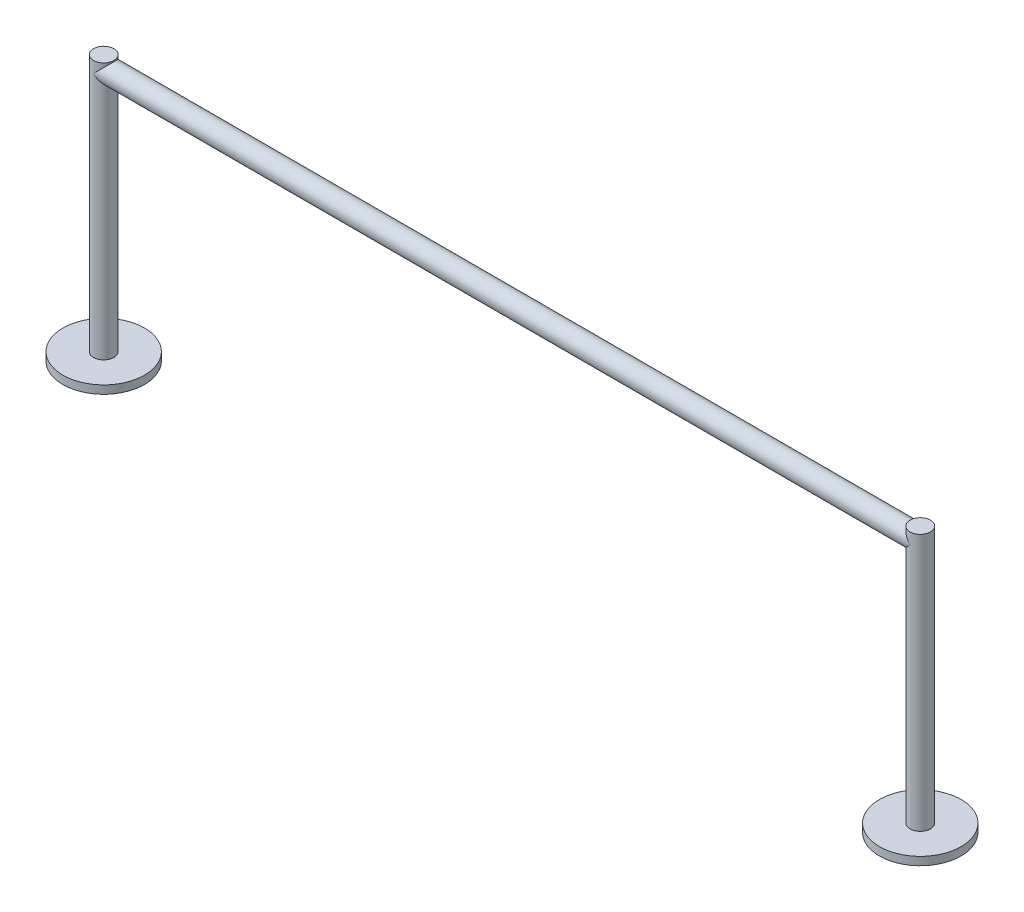
ISO-10303-21;
HEADER;
FILE_DESCRIPTION(('STEP AP214'),'2;1');
FILE_NAME('part.step','',(''),(''),'','','');
FILE_SCHEMA(('AUTOMOTIVE_DESIGN { 1 0 10303 214 1 1 1 1 }'));
ENDSEC;
DATA;
#1=APPLICATION_CONTEXT('core data for automotive mechanical design processes');
#2=APPLICATION_PROTOCOL_DEFINITION('international standard','automotive_design',2000,#1);
#3=PRODUCT_CONTEXT('',#1,'mechanical');
#4=PRODUCT('Part','Part','',(#3));
#5=PRODUCT_RELATED_PRODUCT_CATEGORY('part','',(#4));
#6=PRODUCT_DEFINITION_FORMATION('','',#4);
#7=PRODUCT_DEFINITION_CONTEXT('part definition',#1,'design');
#8=PRODUCT_DEFINITION('design','',#6,#7);
#9=PRODUCT_DEFINITION_SHAPE('','',#8);
#10=(LENGTH_UNIT() NAMED_UNIT(*) SI_UNIT(.MILLI.,.METRE.));
#11=(NAMED_UNIT(*) PLANE_ANGLE_UNIT() SI_UNIT($,.RADIAN.));
#12=(NAMED_UNIT(*) SI_UNIT($,.STERADIAN.) SOLID_ANGLE_UNIT());
#13=UNCERTAINTY_MEASURE_WITH_UNIT(LENGTH_MEASURE(1.E-05),#10,'distance_accuracy_value','');
#14=(GEOMETRIC_REPRESENTATION_CONTEXT(3) GLOBAL_UNCERTAINTY_ASSIGNED_CONTEXT((#13)) GLOBAL_UNIT_ASSIGNED_CONTEXT((#10,
#11,#12)) REPRESENTATION_CONTEXT('',''));
#15=CARTESIAN_POINT('',(0.,0.,0.));
#16=DIRECTION('',(0.,0.,1.));
#17=DIRECTION('',(1.,0.,0.));
#18=AXIS2_PLACEMENT_3D('',#15,#16,#17);
#19=CARTESIAN_POINT('',(1000.,311.132818198842,0.));
#20=DIRECTION('',(-1.,0.,0.));
#21=DIRECTION('',(0.,0.,1.));
#22=AXIS2_PLACEMENT_3D('',#19,#20,#21);
#23=CYLINDRICAL_SURFACE('',#22,12.4999999999993);
#24=CARTESIAN_POINT('',(0.,311.132818198842,0.));
#25=DIRECTION('',(0.707106781186547,-0.707106781186547,0.));
#26=DIRECTION('',(-0.707106781186547,-0.707106781186547,0.));
#27=AXIS2_PLACEMENT_3D('',#24,#25,#26);
#28=ELLIPSE('',#27,17.6776695296632,12.4999999999996);
#29=CARTESIAN_POINT('',(0.,311.132818198842,-12.5));
#30=VERTEX_POINT('',#29);
#31=CARTESIAN_POINT('',(0.,311.132818198842,12.5));
#32=VERTEX_POINT('',#31);
#33=EDGE_CURVE('E56',#30,#32,#28,.T.);
#34=ORIENTED_EDGE('',*,*,#33,.T.);
#35=CARTESIAN_POINT('',(0.,311.132818198842,0.));
#36=DIRECTION('',(-0.707106781186547,-0.707106781186547,0.));
#37=DIRECTION('',(0.707106781186547,-0.707106781186547,0.));
#38=AXIS2_PLACEMENT_3D('',#35,#36,#37);
#39=ELLIPSE('',#38,17.6776695296632,12.4999999999996);
#40=EDGE_CURVE('E11',#32,#30,#39,.F.);
#41=ORIENTED_EDGE('',*,*,#40,.T.);
#42=EDGE_LOOP('',(#34,#41));
#43=FACE_BOUND('',#42,.T.);
#44=CARTESIAN_POINT('',(1000.,311.132818198842,0.));
#45=DIRECTION('',(-0.707106781186547,-0.707106781186547,0.));
#46=DIRECTION('',(-0.707106781186547,0.707106781186547,0.));
#47=AXIS2_PLACEMENT_3D('',#44,#45,#46);
#48=ELLIPSE('',#47,17.6776695296632,12.4999999999996);
#49=CARTESIAN_POINT('',(1000.,311.132818198842,-12.5000000000001));
#50=VERTEX_POINT('',#49);
#51=CARTESIAN_POINT('',(1000.,311.132818198842,12.4999999999999));
#52=VERTEX_POINT('',#51);
#53=EDGE_CURVE('E72',#50,#52,#48,.F.);
#54=ORIENTED_EDGE('',*,*,#53,.F.);
#55=CARTESIAN_POINT('',(1000.,311.132818198842,0.));
#56=DIRECTION('',(-0.707106781186547,0.707106781186547,0.));
#57=DIRECTION('',(-0.707106781186547,-0.707106781186547,0.));
#58=AXIS2_PLACEMENT_3D('',#55,#56,#57);
#59=ELLIPSE('',#58,17.6776695296632,12.4999999999996);
#60=EDGE_CURVE('E62',#52,#50,#59,.F.);
#61=ORIENTED_EDGE('',*,*,#60,.F.);
#62=EDGE_LOOP('',(#54,#61));
#63=FACE_BOUND('',#62,.T.);
#64=ADVANCED_FACE('F47',(#43,#63),#23,.T.);
#65=CARTESIAN_POINT('',(0.,325.,0.));
#66=DIRECTION('',(0.,-1.,0.));
#67=DIRECTION('',(0.,0.,-1.));
#68=AXIS2_PLACEMENT_3D('',#65,#66,#67);
#69=CYLINDRICAL_SURFACE('',#68,12.5);
#70=CARTESIAN_POINT('',(0.,10.,0.));
#71=DIRECTION('',(0.,1.,0.));
#72=DIRECTION('',(0.,0.,1.));
#73=AXIS2_PLACEMENT_3D('',#70,#71,#72);
#74=CIRCLE('',#73,12.5);
#75=CARTESIAN_POINT('',(0.,10.,12.5));
#76=VERTEX_POINT('',#75);
#77=EDGE_CURVE('E89',#76,#76,#74,.T.);
#78=ORIENTED_EDGE('',*,*,#77,.T.);
#79=EDGE_LOOP('',(#78));
#80=FACE_BOUND('',#79,.T.);
#81=CARTESIAN_POINT('',(0.,325.,0.));
#82=DIRECTION('',(0.,1.,0.));
#83=DIRECTION('',(0.,0.,1.));
#84=AXIS2_PLACEMENT_3D('',#81,#82,#83);
#85=CIRCLE('',#84,12.5);
#86=CARTESIAN_POINT('',(0.,325.,12.5));
#87=VERTEX_POINT('',#86);
#88=EDGE_CURVE('E75',#87,#87,#85,.T.);
#89=ORIENTED_EDGE('',*,*,#88,.F.);
#90=EDGE_LOOP('',(#89));
#91=FACE_BOUND('',#90,.T.);
#92=ORIENTED_EDGE('',*,*,#40,.F.);
#93=ORIENTED_EDGE('',*,*,#33,.F.);
#94=EDGE_LOOP('',(#92,#93));
#95=FACE_BOUND('',#94,.T.);
#96=ADVANCED_FACE('F105',(#80,#91,#95),#69,.T.);
#97=CARTESIAN_POINT('',(0.,10.,0.));
#98=DIRECTION('',(0.,-1.,0.));
#99=DIRECTION('',(0.,0.,-1.));
#100=AXIS2_PLACEMENT_3D('',#97,#98,#99);
#101=CYLINDRICAL_SURFACE('',#100,50.);
#102=CARTESIAN_POINT('',(0.,10.,0.));
#103=DIRECTION('',(0.,1.,0.));
#104=DIRECTION('',(0.,0.,1.));
#105=AXIS2_PLACEMENT_3D('',#102,#103,#104);
#106=CIRCLE('',#105,50.);
#107=CARTESIAN_POINT('',(0.,10.,50.));
#108=VERTEX_POINT('',#107);
#109=EDGE_CURVE('E93',#108,#108,#106,.T.);
#110=ORIENTED_EDGE('',*,*,#109,.F.);
#111=EDGE_LOOP('',(#110));
#112=FACE_BOUND('',#111,.T.);
#113=CARTESIAN_POINT('',(0.,0.,0.));
#114=DIRECTION('',(0.,1.,0.));
#115=DIRECTION('',(0.,0.,1.));
#116=AXIS2_PLACEMENT_3D('',#113,#114,#115);
#117=CIRCLE('',#116,50.);
#118=CARTESIAN_POINT('',(0.,0.,50.));
#119=VERTEX_POINT('',#118);
#120=EDGE_CURVE('E97',#119,#119,#117,.T.);
#121=ORIENTED_EDGE('',*,*,#120,.T.);
#122=EDGE_LOOP('',(#121));
#123=FACE_BOUND('',#122,.T.);
#124=ADVANCED_FACE('F49',(#112,#123),#101,.T.);
#125=CARTESIAN_POINT('',(0.,10.,0.));
#126=DIRECTION('',(0.,1.,0.));
#127=DIRECTION('',(0.,0.,1.));
#128=AXIS2_PLACEMENT_3D('',#125,#126,#127);
#129=PLANE('',#128);
#130=ORIENTED_EDGE('',*,*,#77,.F.);
#131=EDGE_LOOP('',(#130));
#132=FACE_BOUND('',#131,.T.);
#133=ORIENTED_EDGE('',*,*,#109,.T.);
#134=EDGE_LOOP('',(#133));
#135=FACE_BOUND('',#134,.T.);
#136=ADVANCED_FACE('F114',(#132,#135),#129,.T.);
#137=CARTESIAN_POINT('',(0.,0.,0.));
#138=DIRECTION('',(0.,1.,0.));
#139=DIRECTION('',(0.,0.,1.));
#140=AXIS2_PLACEMENT_3D('',#137,#138,#139);
#141=PLANE('',#140);
#142=ORIENTED_EDGE('',*,*,#120,.F.);
#143=EDGE_LOOP('',(#142));
#144=FACE_BOUND('',#143,.T.);
#145=ADVANCED_FACE('F123',(#144),#141,.F.);
#146=CARTESIAN_POINT('',(0.,325.,0.));
#147=DIRECTION('',(0.,1.,0.));
#148=DIRECTION('',(0.,0.,1.));
#149=AXIS2_PLACEMENT_3D('',#146,#147,#148);
#150=PLANE('',#149);
#151=ORIENTED_EDGE('',*,*,#88,.T.);
#152=EDGE_LOOP('',(#151));
#153=FACE_BOUND('',#152,.T.);
#154=ADVANCED_FACE('F120',(#153),#150,.T.);
#155=CARTESIAN_POINT('',(1000.,325.,-1.22464679914735E-13));
#156=DIRECTION('',(0.,-1.,0.));
#157=DIRECTION('',(0.,0.,-1.));
#158=AXIS2_PLACEMENT_3D('',#155,#156,#157);
#159=CYLINDRICAL_SURFACE('',#158,12.5);
#160=CARTESIAN_POINT('',(1000.,325.,-1.22464679914735E-13));
#161=DIRECTION('',(0.,1.,0.));
#162=DIRECTION('',(0.,0.,1.));
#163=AXIS2_PLACEMENT_3D('',#160,#161,#162);
#164=CIRCLE('',#163,12.5);
#165=CARTESIAN_POINT('',(1000.,325.,12.4999999999999));
#166=VERTEX_POINT('',#165);
#167=EDGE_CURVE('E215',#166,#166,#164,.T.);
#168=ORIENTED_EDGE('',*,*,#167,.F.);
#169=EDGE_LOOP('',(#168));
#170=FACE_BOUND('',#169,.T.);
#171=CARTESIAN_POINT('',(1000.,10.,-1.22464679914735E-13));
#172=DIRECTION('',(0.,1.,0.));
#173=DIRECTION('',(0.,0.,1.));
#174=AXIS2_PLACEMENT_3D('',#171,#172,#173);
#175=CIRCLE('',#174,12.5);
#176=CARTESIAN_POINT('',(1000.,10.,12.4999999999999));
#177=VERTEX_POINT('',#176);
#178=EDGE_CURVE('E79',#177,#177,#175,.T.);
#179=ORIENTED_EDGE('',*,*,#178,.T.);
#180=EDGE_LOOP('',(#179));
#181=FACE_BOUND('',#180,.T.);
#182=ORIENTED_EDGE('',*,*,#60,.T.);
#183=ORIENTED_EDGE('',*,*,#53,.T.);
#184=EDGE_LOOP('',(#182,#183));
#185=FACE_BOUND('',#184,.T.);
#186=ADVANCED_FACE('F77',(#170,#181,#185),#159,.T.);
#187=CARTESIAN_POINT('',(1000.,10.,-1.22464679914735E-13));
#188=DIRECTION('',(0.,-1.,0.));
#189=DIRECTION('',(0.,0.,-1.));
#190=AXIS2_PLACEMENT_3D('',#187,#188,#189);
#191=CYLINDRICAL_SURFACE('',#190,50.);
#192=CARTESIAN_POINT('',(1000.,10.,-1.22464679914735E-13));
#193=DIRECTION('',(0.,1.,0.));
#194=DIRECTION('',(0.,0.,1.));
#195=AXIS2_PLACEMENT_3D('',#192,#193,#194);
#196=CIRCLE('',#195,50.);
#197=CARTESIAN_POINT('',(1000.,10.,49.9999999999999));
#198=VERTEX_POINT('',#197);
#199=EDGE_CURVE('E86',#198,#198,#196,.T.);
#200=ORIENTED_EDGE('',*,*,#199,.F.);
#201=EDGE_LOOP('',(#200));
#202=FACE_BOUND('',#201,.T.);
#203=CARTESIAN_POINT('',(1000.,0.,-1.22464679914735E-13));
#204=DIRECTION('',(0.,1.,0.));
#205=DIRECTION('',(0.,0.,1.));
#206=AXIS2_PLACEMENT_3D('',#203,#204,#205);
#207=CIRCLE('',#206,50.);
#208=CARTESIAN_POINT('',(1000.,0.,49.9999999999999));
#209=VERTEX_POINT('',#208);
#210=EDGE_CURVE('E83',#209,#209,#207,.T.);
#211=ORIENTED_EDGE('',*,*,#210,.T.);
#212=EDGE_LOOP('',(#211));
#213=FACE_BOUND('',#212,.T.);
#214=ADVANCED_FACE('F180',(#202,#213),#191,.T.);
#215=CARTESIAN_POINT('',(1000.,10.,-1.22464679914735E-13));
#216=DIRECTION('',(0.,1.,0.));
#217=DIRECTION('',(0.,0.,1.));
#218=AXIS2_PLACEMENT_3D('',#215,#216,#217);
#219=PLANE('',#218);
#220=ORIENTED_EDGE('',*,*,#178,.F.);
#221=EDGE_LOOP('',(#220));
#222=FACE_BOUND('',#221,.T.);
#223=ORIENTED_EDGE('',*,*,#199,.T.);
#224=EDGE_LOOP('',(#223));
#225=FACE_BOUND('',#224,.T.);
#226=ADVANCED_FACE('F171',(#222,#225),#219,.T.);
#227=CARTESIAN_POINT('',(1000.,0.,-1.22464679914735E-13));
#228=DIRECTION('',(0.,1.,0.));
#229=DIRECTION('',(0.,0.,1.));
#230=AXIS2_PLACEMENT_3D('',#227,#228,#229);
#231=PLANE('',#230);
#232=ORIENTED_EDGE('',*,*,#210,.F.);
#233=EDGE_LOOP('',(#232));
#234=FACE_BOUND('',#233,.T.);
#235=ADVANCED_FACE('F162',(#234),#231,.F.);
#236=CARTESIAN_POINT('',(0.,325.,0.));
#237=DIRECTION('',(0.,1.,0.));
#238=DIRECTION('',(0.,0.,1.));
#239=AXIS2_PLACEMENT_3D('',#236,#237,#238);
#240=PLANE('',#239);
#241=ORIENTED_EDGE('',*,*,#167,.T.);
#242=EDGE_LOOP('',(#241));
#243=FACE_BOUND('',#242,.T.);
#244=ADVANCED_FACE('F157',(#243),#240,.T.);
#245=CLOSED_SHELL('',(#64,#96,#124,#136,#145,#154,#186,#214,#226,#235,#244));
#246=MANIFOLD_SOLID_BREP('B2',#245);
#247=ADVANCED_BREP_SHAPE_REPRESENTATION('',(#18,#246),#14);
#248=SHAPE_DEFINITION_REPRESENTATION(#9,#247);
ENDSEC;
END-ISO-10303-21;
